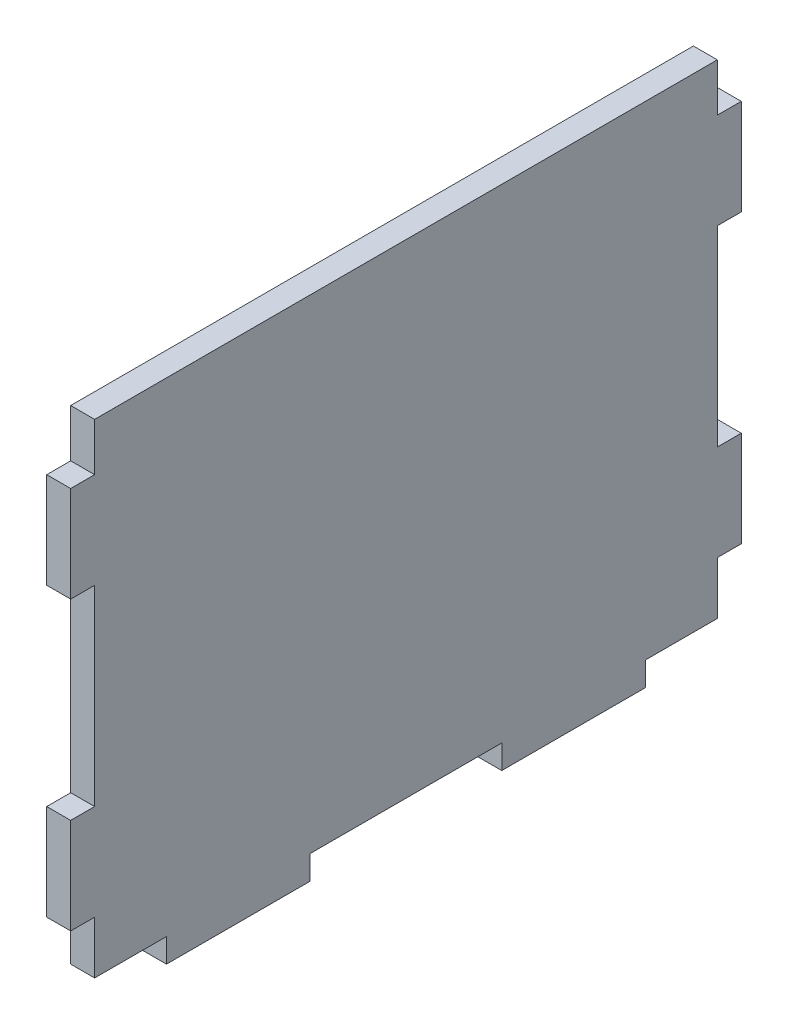
ISO-10303-21;
HEADER;
FILE_DESCRIPTION(('STEP AP214'),'2;1');
FILE_NAME('part.step','',(''),(''),'','','');
FILE_SCHEMA(('AUTOMOTIVE_DESIGN { 1 0 10303 214 1 1 1 1 }'));
ENDSEC;
DATA;
#1=APPLICATION_CONTEXT('core data for automotive mechanical design processes');
#2=APPLICATION_PROTOCOL_DEFINITION('international standard','automotive_design',2000,#1);
#3=PRODUCT_CONTEXT('',#1,'mechanical');
#4=PRODUCT('Part','Part','',(#3));
#5=PRODUCT_RELATED_PRODUCT_CATEGORY('part','',(#4));
#6=PRODUCT_DEFINITION_FORMATION('','',#4);
#7=PRODUCT_DEFINITION_CONTEXT('part definition',#1,'design');
#8=PRODUCT_DEFINITION('design','',#6,#7);
#9=PRODUCT_DEFINITION_SHAPE('','',#8);
#10=(LENGTH_UNIT() NAMED_UNIT(*) SI_UNIT(.MILLI.,.METRE.));
#11=(NAMED_UNIT(*) PLANE_ANGLE_UNIT() SI_UNIT($,.RADIAN.));
#12=(NAMED_UNIT(*) SI_UNIT($,.STERADIAN.) SOLID_ANGLE_UNIT());
#13=UNCERTAINTY_MEASURE_WITH_UNIT(LENGTH_MEASURE(1.E-05),#10,'distance_accuracy_value','');
#14=(GEOMETRIC_REPRESENTATION_CONTEXT(3) GLOBAL_UNCERTAINTY_ASSIGNED_CONTEXT((#13)) GLOBAL_UNIT_ASSIGNED_CONTEXT((#10,
#11,#12)) REPRESENTATION_CONTEXT('',''));
#15=CARTESIAN_POINT('',(0.,0.,0.));
#16=DIRECTION('',(0.,0.,1.));
#17=DIRECTION('',(1.,0.,0.));
#18=AXIS2_PLACEMENT_3D('',#15,#16,#17);
#19=CARTESIAN_POINT('',(2.5,0.,-32.4999999999995));
#20=DIRECTION('',(0.,0.,-1.));
#21=DIRECTION('',(-1.,0.,0.));
#22=AXIS2_PLACEMENT_3D('',#19,#20,#21);
#23=PLANE('',#22);
#24=DIRECTION('',(0.,-1.,0.));
#25=VECTOR('',#24,1.);
#26=CARTESIAN_POINT('',(0.,0.,-32.4999999999995));
#27=LINE('',#26,#25);
#28=CARTESIAN_POINT('',(0.,24.9999999999998,-32.4999999999995));
#29=VERTEX_POINT('',#28);
#30=CARTESIAN_POINT('',(0.,19.9999999999999,-32.4999999999995));
#31=VERTEX_POINT('',#30);
#32=EDGE_CURVE('E259',#29,#31,#27,.T.);
#33=ORIENTED_EDGE('',*,*,#32,.F.);
#34=DIRECTION('',(-1.,0.,0.));
#35=VECTOR('',#34,1.);
#36=CARTESIAN_POINT('',(2.5,24.9999999999998,-32.4999999999995));
#37=LINE('',#36,#35);
#38=CARTESIAN_POINT('',(2.5,24.9999999999998,-32.4999999999995));
#39=VERTEX_POINT('',#38);
#40=EDGE_CURVE('E11',#39,#29,#37,.T.);
#41=ORIENTED_EDGE('',*,*,#40,.F.);
#42=DIRECTION('',(0.,-1.,0.));
#43=VECTOR('',#42,1.);
#44=CARTESIAN_POINT('',(2.5,0.,-32.4999999999995));
#45=LINE('',#44,#43);
#46=CARTESIAN_POINT('',(2.5,19.9999999999999,-32.4999999999995));
#47=VERTEX_POINT('',#46);
#48=EDGE_CURVE('E353',#39,#47,#45,.T.);
#49=ORIENTED_EDGE('',*,*,#48,.T.);
#50=DIRECTION('',(-1.,0.,0.));
#51=VECTOR('',#50,1.);
#52=CARTESIAN_POINT('',(2.5,19.9999999999999,-32.4999999999995));
#53=LINE('',#52,#51);
#54=EDGE_CURVE('E153',#47,#31,#53,.T.);
#55=ORIENTED_EDGE('',*,*,#54,.T.);
#56=EDGE_LOOP('',(#33,#41,#49,#55));
#57=FACE_BOUND('',#56,.T.);
#58=ADVANCED_FACE('F41',(#57),#23,.T.);
#59=CARTESIAN_POINT('',(2.5,24.9999999999998,0.));
#60=DIRECTION('',(0.,1.,0.));
#61=DIRECTION('',(0.,0.,1.));
#62=AXIS2_PLACEMENT_3D('',#59,#60,#61);
#63=PLANE('',#62);
#64=DIRECTION('',(0.,0.,-1.));
#65=VECTOR('',#64,1.);
#66=CARTESIAN_POINT('',(0.,24.9999999999998,0.));
#67=LINE('',#66,#65);
#68=CARTESIAN_POINT('',(0.,24.9999999999998,32.4999999999995));
#69=VERTEX_POINT('',#68);
#70=EDGE_CURVE('E263',#69,#29,#67,.T.);
#71=ORIENTED_EDGE('',*,*,#70,.F.);
#72=DIRECTION('',(-1.,0.,0.));
#73=VECTOR('',#72,1.);
#74=CARTESIAN_POINT('',(2.5,24.9999999999998,32.4999999999995));
#75=LINE('',#74,#73);
#76=CARTESIAN_POINT('',(2.5,24.9999999999998,32.4999999999995));
#77=VERTEX_POINT('',#76);
#78=EDGE_CURVE('E50',#77,#69,#75,.T.);
#79=ORIENTED_EDGE('',*,*,#78,.F.);
#80=DIRECTION('',(0.,0.,-1.));
#81=VECTOR('',#80,1.);
#82=CARTESIAN_POINT('',(2.5,24.9999999999998,0.));
#83=LINE('',#82,#81);
#84=EDGE_CURVE('E447',#77,#39,#83,.T.);
#85=ORIENTED_EDGE('',*,*,#84,.T.);
#86=ORIENTED_EDGE('',*,*,#40,.T.);
#87=EDGE_LOOP('',(#71,#79,#85,#86));
#88=FACE_BOUND('',#87,.T.);
#89=ADVANCED_FACE('F446',(#88),#63,.T.);
#90=CARTESIAN_POINT('',(2.5,0.,32.4999999999995));
#91=DIRECTION('',(0.,0.,-1.));
#92=DIRECTION('',(-1.,0.,0.));
#93=AXIS2_PLACEMENT_3D('',#90,#91,#92);
#94=PLANE('',#93);
#95=DIRECTION('',(0.,-1.,0.));
#96=VECTOR('',#95,1.);
#97=CARTESIAN_POINT('',(0.,0.,32.4999999999995));
#98=LINE('',#97,#96);
#99=CARTESIAN_POINT('',(0.,19.9999999999999,32.4999999999995));
#100=VERTEX_POINT('',#99);
#101=EDGE_CURVE('E267',#69,#100,#98,.T.);
#102=ORIENTED_EDGE('',*,*,#101,.T.);
#103=DIRECTION('',(-1.,0.,0.));
#104=VECTOR('',#103,1.);
#105=CARTESIAN_POINT('',(2.5,19.9999999999999,32.4999999999995));
#106=LINE('',#105,#104);
#107=CARTESIAN_POINT('',(2.5,19.9999999999999,32.4999999999995));
#108=VERTEX_POINT('',#107);
#109=EDGE_CURVE('E430',#108,#100,#106,.T.);
#110=ORIENTED_EDGE('',*,*,#109,.F.);
#111=DIRECTION('',(0.,-1.,0.));
#112=VECTOR('',#111,1.);
#113=CARTESIAN_POINT('',(2.5,0.,32.4999999999995));
#114=LINE('',#113,#112);
#115=EDGE_CURVE('E438',#77,#108,#114,.T.);
#116=ORIENTED_EDGE('',*,*,#115,.F.);
#117=ORIENTED_EDGE('',*,*,#78,.T.);
#118=EDGE_LOOP('',(#102,#110,#116,#117));
#119=FACE_BOUND('',#118,.T.);
#120=ADVANCED_FACE('F436',(#119),#94,.F.);
#121=CARTESIAN_POINT('',(2.5,19.9999999999999,0.));
#122=DIRECTION('',(0.,1.,0.));
#123=DIRECTION('',(0.,0.,1.));
#124=AXIS2_PLACEMENT_3D('',#121,#122,#123);
#125=PLANE('',#124);
#126=DIRECTION('',(0.,0.,-1.));
#127=VECTOR('',#126,1.);
#128=CARTESIAN_POINT('',(0.,19.9999999999999,0.));
#129=LINE('',#128,#127);
#130=CARTESIAN_POINT('',(0.,19.9999999999999,34.9999999999995));
#131=VERTEX_POINT('',#130);
#132=EDGE_CURVE('E271',#131,#100,#129,.T.);
#133=ORIENTED_EDGE('',*,*,#132,.F.);
#134=DIRECTION('',(-1.,0.,0.));
#135=VECTOR('',#134,1.);
#136=CARTESIAN_POINT('',(2.5,19.9999999999999,34.9999999999995));
#137=LINE('',#136,#135);
#138=CARTESIAN_POINT('',(2.5,19.9999999999999,34.9999999999995));
#139=VERTEX_POINT('',#138);
#140=EDGE_CURVE('E427',#139,#131,#137,.T.);
#141=ORIENTED_EDGE('',*,*,#140,.F.);
#142=DIRECTION('',(0.,0.,-1.));
#143=VECTOR('',#142,1.);
#144=CARTESIAN_POINT('',(2.5,19.9999999999999,0.));
#145=LINE('',#144,#143);
#146=EDGE_CURVE('E458',#139,#108,#145,.T.);
#147=ORIENTED_EDGE('',*,*,#146,.T.);
#148=ORIENTED_EDGE('',*,*,#109,.T.);
#149=EDGE_LOOP('',(#133,#141,#147,#148));
#150=FACE_BOUND('',#149,.T.);
#151=ADVANCED_FACE('F591',(#150),#125,.T.);
#152=CARTESIAN_POINT('',(2.5,0.,34.9999999999995));
#153=DIRECTION('',(0.,0.,1.));
#154=DIRECTION('',(0.,-1.,0.));
#155=AXIS2_PLACEMENT_3D('',#152,#153,#154);
#156=PLANE('',#155);
#157=DIRECTION('',(0.,1.,0.));
#158=VECTOR('',#157,1.);
#159=CARTESIAN_POINT('',(0.,0.,34.9999999999995));
#160=LINE('',#159,#158);
#161=CARTESIAN_POINT('',(0.,9.99999999999986,34.9999999999995));
#162=VERTEX_POINT('',#161);
#163=EDGE_CURVE('E275',#162,#131,#160,.T.);
#164=ORIENTED_EDGE('',*,*,#163,.F.);
#165=DIRECTION('',(-1.,0.,0.));
#166=VECTOR('',#165,1.);
#167=CARTESIAN_POINT('',(2.5,9.99999999999986,34.9999999999995));
#168=LINE('',#167,#166);
#169=CARTESIAN_POINT('',(2.5,9.99999999999986,34.9999999999995));
#170=VERTEX_POINT('',#169);
#171=EDGE_CURVE('E424',#170,#162,#168,.T.);
#172=ORIENTED_EDGE('',*,*,#171,.F.);
#173=DIRECTION('',(0.,1.,0.));
#174=VECTOR('',#173,1.);
#175=CARTESIAN_POINT('',(2.5,0.,34.9999999999995));
#176=LINE('',#175,#174);
#177=EDGE_CURVE('E462',#170,#139,#176,.T.);
#178=ORIENTED_EDGE('',*,*,#177,.T.);
#179=ORIENTED_EDGE('',*,*,#140,.T.);
#180=EDGE_LOOP('',(#164,#172,#178,#179));
#181=FACE_BOUND('',#180,.T.);
#182=ADVANCED_FACE('F596',(#181),#156,.T.);
#183=CARTESIAN_POINT('',(2.5,9.99999999999989,0.));
#184=DIRECTION('',(0.,-1.,0.));
#185=DIRECTION('',(0.,0.,-1.));
#186=AXIS2_PLACEMENT_3D('',#183,#184,#185);
#187=PLANE('',#186);
#188=DIRECTION('',(0.,0.,1.));
#189=VECTOR('',#188,1.);
#190=CARTESIAN_POINT('',(0.,9.99999999999989,0.));
#191=LINE('',#190,#189);
#192=CARTESIAN_POINT('',(0.,9.99999999999987,32.4999999999995));
#193=VERTEX_POINT('',#192);
#194=EDGE_CURVE('E279',#193,#162,#191,.T.);
#195=ORIENTED_EDGE('',*,*,#194,.F.);
#196=DIRECTION('',(-1.,0.,0.));
#197=VECTOR('',#196,1.);
#198=CARTESIAN_POINT('',(2.5,9.99999999999987,32.4999999999995));
#199=LINE('',#198,#197);
#200=CARTESIAN_POINT('',(2.5,9.99999999999987,32.4999999999995));
#201=VERTEX_POINT('',#200);
#202=EDGE_CURVE('E421',#201,#193,#199,.T.);
#203=ORIENTED_EDGE('',*,*,#202,.F.);
#204=DIRECTION('',(0.,0.,1.));
#205=VECTOR('',#204,1.);
#206=CARTESIAN_POINT('',(2.5,9.99999999999989,0.));
#207=LINE('',#206,#205);
#208=EDGE_CURVE('E466',#201,#170,#207,.T.);
#209=ORIENTED_EDGE('',*,*,#208,.T.);
#210=ORIENTED_EDGE('',*,*,#171,.T.);
#211=EDGE_LOOP('',(#195,#203,#209,#210));
#212=FACE_BOUND('',#211,.T.);
#213=ADVANCED_FACE('F600',(#212),#187,.T.);
#214=CARTESIAN_POINT('',(2.5,0.,32.4999999999995));
#215=DIRECTION('',(0.,0.,1.));
#216=DIRECTION('',(1.,0.,0.));
#217=AXIS2_PLACEMENT_3D('',#214,#215,#216);
#218=PLANE('',#217);
#219=DIRECTION('',(0.,1.,0.));
#220=VECTOR('',#219,1.);
#221=CARTESIAN_POINT('',(0.,0.,32.4999999999995));
#222=LINE('',#221,#220);
#223=CARTESIAN_POINT('',(0.,-9.99999999999987,32.4999999999995));
#224=VERTEX_POINT('',#223);
#225=EDGE_CURVE('E283',#224,#193,#222,.T.);
#226=ORIENTED_EDGE('',*,*,#225,.F.);
#227=DIRECTION('',(-1.,0.,0.));
#228=VECTOR('',#227,1.);
#229=CARTESIAN_POINT('',(2.5,-9.99999999999987,32.4999999999995));
#230=LINE('',#229,#228);
#231=CARTESIAN_POINT('',(2.5,-9.99999999999987,32.4999999999995));
#232=VERTEX_POINT('',#231);
#233=EDGE_CURVE('E418',#232,#224,#230,.T.);
#234=ORIENTED_EDGE('',*,*,#233,.F.);
#235=DIRECTION('',(0.,1.,0.));
#236=VECTOR('',#235,1.);
#237=CARTESIAN_POINT('',(2.5,0.,32.4999999999995));
#238=LINE('',#237,#236);
#239=EDGE_CURVE('E470',#232,#201,#238,.T.);
#240=ORIENTED_EDGE('',*,*,#239,.T.);
#241=ORIENTED_EDGE('',*,*,#202,.T.);
#242=EDGE_LOOP('',(#226,#234,#240,#241));
#243=FACE_BOUND('',#242,.T.);
#244=ADVANCED_FACE('F604',(#243),#218,.T.);
#245=CARTESIAN_POINT('',(2.5,-9.99999999999989,0.));
#246=DIRECTION('',(0.,-1.,0.));
#247=DIRECTION('',(0.,0.,-1.));
#248=AXIS2_PLACEMENT_3D('',#245,#246,#247);
#249=PLANE('',#248);
#250=DIRECTION('',(0.,0.,1.));
#251=VECTOR('',#250,1.);
#252=CARTESIAN_POINT('',(0.,-9.99999999999989,0.));
#253=LINE('',#252,#251);
#254=CARTESIAN_POINT('',(0.,-9.99999999999986,34.9999999999995));
#255=VERTEX_POINT('',#254);
#256=EDGE_CURVE('E287',#224,#255,#253,.T.);
#257=ORIENTED_EDGE('',*,*,#256,.T.);
#258=DIRECTION('',(-1.,0.,0.));
#259=VECTOR('',#258,1.);
#260=CARTESIAN_POINT('',(2.5,-9.99999999999986,34.9999999999995));
#261=LINE('',#260,#259);
#262=CARTESIAN_POINT('',(2.5,-9.99999999999986,34.9999999999995));
#263=VERTEX_POINT('',#262);
#264=EDGE_CURVE('E414',#263,#255,#261,.T.);
#265=ORIENTED_EDGE('',*,*,#264,.F.);
#266=DIRECTION('',(0.,0.,1.));
#267=VECTOR('',#266,1.);
#268=CARTESIAN_POINT('',(2.5,-9.99999999999989,0.));
#269=LINE('',#268,#267);
#270=EDGE_CURVE('E474',#232,#263,#269,.T.);
#271=ORIENTED_EDGE('',*,*,#270,.F.);
#272=ORIENTED_EDGE('',*,*,#233,.T.);
#273=EDGE_LOOP('',(#257,#265,#271,#272));
#274=FACE_BOUND('',#273,.T.);
#275=ADVANCED_FACE('F608',(#274),#249,.F.);
#276=CARTESIAN_POINT('',(2.5,0.,34.9999999999995));
#277=DIRECTION('',(0.,0.,-1.));
#278=DIRECTION('',(0.,1.,0.));
#279=AXIS2_PLACEMENT_3D('',#276,#277,#278);
#280=PLANE('',#279);
#281=DIRECTION('',(0.,-1.,0.));
#282=VECTOR('',#281,1.);
#283=CARTESIAN_POINT('',(0.,0.,34.9999999999995));
#284=LINE('',#283,#282);
#285=CARTESIAN_POINT('',(0.,-19.9999999999999,34.9999999999995));
#286=VERTEX_POINT('',#285);
#287=EDGE_CURVE('E290',#255,#286,#284,.T.);
#288=ORIENTED_EDGE('',*,*,#287,.T.);
#289=DIRECTION('',(-1.,0.,0.));
#290=VECTOR('',#289,1.);
#291=CARTESIAN_POINT('',(2.5,-19.9999999999999,34.9999999999995));
#292=LINE('',#291,#290);
#293=CARTESIAN_POINT('',(2.5,-19.9999999999999,34.9999999999995));
#294=VERTEX_POINT('',#293);
#295=EDGE_CURVE('E410',#294,#286,#292,.T.);
#296=ORIENTED_EDGE('',*,*,#295,.F.);
#297=DIRECTION('',(0.,-1.,0.));
#298=VECTOR('',#297,1.);
#299=CARTESIAN_POINT('',(2.5,0.,34.9999999999995));
#300=LINE('',#299,#298);
#301=EDGE_CURVE('E477',#263,#294,#300,.T.);
#302=ORIENTED_EDGE('',*,*,#301,.F.);
#303=ORIENTED_EDGE('',*,*,#264,.T.);
#304=EDGE_LOOP('',(#288,#296,#302,#303));
#305=FACE_BOUND('',#304,.T.);
#306=ADVANCED_FACE('F612',(#305),#280,.F.);
#307=CARTESIAN_POINT('',(2.5,-19.9999999999999,0.));
#308=DIRECTION('',(0.,1.,0.));
#309=DIRECTION('',(0.,0.,1.));
#310=AXIS2_PLACEMENT_3D('',#307,#308,#309);
#311=PLANE('',#310);
#312=DIRECTION('',(0.,0.,-1.));
#313=VECTOR('',#312,1.);
#314=CARTESIAN_POINT('',(0.,-19.9999999999999,0.));
#315=LINE('',#314,#313);
#316=CARTESIAN_POINT('',(0.,-19.9999999999999,32.4999999999995));
#317=VERTEX_POINT('',#316);
#318=EDGE_CURVE('E293',#286,#317,#315,.T.);
#319=ORIENTED_EDGE('',*,*,#318,.T.);
#320=DIRECTION('',(-1.,0.,0.));
#321=VECTOR('',#320,1.);
#322=CARTESIAN_POINT('',(2.5,-19.9999999999999,32.4999999999995));
#323=LINE('',#322,#321);
#324=CARTESIAN_POINT('',(2.5,-19.9999999999999,32.4999999999995));
#325=VERTEX_POINT('',#324);
#326=EDGE_CURVE('E406',#325,#317,#323,.T.);
#327=ORIENTED_EDGE('',*,*,#326,.F.);
#328=DIRECTION('',(0.,0.,-1.));
#329=VECTOR('',#328,1.);
#330=CARTESIAN_POINT('',(2.5,-19.9999999999999,0.));
#331=LINE('',#330,#329);
#332=EDGE_CURVE('E480',#294,#325,#331,.T.);
#333=ORIENTED_EDGE('',*,*,#332,.F.);
#334=ORIENTED_EDGE('',*,*,#295,.T.);
#335=EDGE_LOOP('',(#319,#327,#333,#334));
#336=FACE_BOUND('',#335,.T.);
#337=ADVANCED_FACE('F616',(#336),#311,.F.);
#338=CARTESIAN_POINT('',(2.5,0.,32.4999999999996));
#339=DIRECTION('',(0.,0.,-1.));
#340=DIRECTION('',(0.,1.,0.));
#341=AXIS2_PLACEMENT_3D('',#338,#339,#340);
#342=PLANE('',#341);
#343=DIRECTION('',(0.,-1.,0.));
#344=VECTOR('',#343,1.);
#345=CARTESIAN_POINT('',(0.,0.,32.4999999999996));
#346=LINE('',#345,#344);
#347=CARTESIAN_POINT('',(0.,-25.5000000000002,32.4999999999995));
#348=VERTEX_POINT('',#347);
#349=EDGE_CURVE('E296',#317,#348,#346,.T.);
#350=ORIENTED_EDGE('',*,*,#349,.T.);
#351=DIRECTION('',(-1.,0.,0.));
#352=VECTOR('',#351,1.);
#353=CARTESIAN_POINT('',(2.5,-25.5000000000002,32.4999999999995));
#354=LINE('',#353,#352);
#355=CARTESIAN_POINT('',(2.5,-25.5000000000002,32.4999999999995));
#356=VERTEX_POINT('',#355);
#357=EDGE_CURVE('E402',#356,#348,#354,.T.);
#358=ORIENTED_EDGE('',*,*,#357,.F.);
#359=DIRECTION('',(0.,-1.,0.));
#360=VECTOR('',#359,1.);
#361=CARTESIAN_POINT('',(2.5,0.,32.4999999999996));
#362=LINE('',#361,#360);
#363=EDGE_CURVE('E483',#325,#356,#362,.T.);
#364=ORIENTED_EDGE('',*,*,#363,.F.);
#365=ORIENTED_EDGE('',*,*,#326,.T.);
#366=EDGE_LOOP('',(#350,#358,#364,#365));
#367=FACE_BOUND('',#366,.T.);
#368=ADVANCED_FACE('F620',(#367),#342,.F.);
#369=CARTESIAN_POINT('',(2.5,-25.5000000000002,0.));
#370=DIRECTION('',(0.,1.,0.));
#371=DIRECTION('',(0.,0.,1.));
#372=AXIS2_PLACEMENT_3D('',#369,#370,#371);
#373=PLANE('',#372);
#374=DIRECTION('',(0.,0.,-1.));
#375=VECTOR('',#374,1.);
#376=CARTESIAN_POINT('',(0.,-25.5000000000002,0.));
#377=LINE('',#376,#375);
#378=CARTESIAN_POINT('',(0.,-25.5000000000002,24.9999999999992));
#379=VERTEX_POINT('',#378);
#380=EDGE_CURVE('E299',#348,#379,#377,.T.);
#381=ORIENTED_EDGE('',*,*,#380,.T.);
#382=DIRECTION('',(-1.,0.,0.));
#383=VECTOR('',#382,1.);
#384=CARTESIAN_POINT('',(2.5,-25.5000000000002,24.9999999999992));
#385=LINE('',#384,#383);
#386=CARTESIAN_POINT('',(2.5,-25.5000000000002,24.9999999999992));
#387=VERTEX_POINT('',#386);
#388=EDGE_CURVE('E398',#387,#379,#385,.T.);
#389=ORIENTED_EDGE('',*,*,#388,.F.);
#390=DIRECTION('',(0.,0.,-1.));
#391=VECTOR('',#390,1.);
#392=CARTESIAN_POINT('',(2.5,-25.5000000000002,0.));
#393=LINE('',#392,#391);
#394=EDGE_CURVE('E486',#356,#387,#393,.T.);
#395=ORIENTED_EDGE('',*,*,#394,.F.);
#396=ORIENTED_EDGE('',*,*,#357,.T.);
#397=EDGE_LOOP('',(#381,#389,#395,#396));
#398=FACE_BOUND('',#397,.T.);
#399=ADVANCED_FACE('F583',(#398),#373,.F.);
#400=CARTESIAN_POINT('',(2.5,3.36536354339456E-12,24.9999999999958));
#401=DIRECTION('',(0.,-1.34614541735805E-13,-1.));
#402=DIRECTION('',(0.,1.,-1.34614541735805E-13));
#403=AXIS2_PLACEMENT_3D('',#400,#401,#402);
#404=PLANE('',#403);
#405=DIRECTION('',(0.,-1.,1.34614541735805E-13));
#406=VECTOR('',#405,1.);
#407=CARTESIAN_POINT('',(0.,3.36536354339456E-12,24.9999999999958));
#408=LINE('',#407,#406);
#409=CARTESIAN_POINT('',(0.,-28.,24.9999999999995));
#410=VERTEX_POINT('',#409);
#411=EDGE_CURVE('E302',#379,#410,#408,.T.);
#412=ORIENTED_EDGE('',*,*,#411,.T.);
#413=DIRECTION('',(-1.,0.,0.));
#414=VECTOR('',#413,1.);
#415=CARTESIAN_POINT('',(2.5,-28.,24.9999999999995));
#416=LINE('',#415,#414);
#417=CARTESIAN_POINT('',(2.5,-28.,24.9999999999995));
#418=VERTEX_POINT('',#417);
#419=EDGE_CURVE('E394',#418,#410,#416,.T.);
#420=ORIENTED_EDGE('',*,*,#419,.F.);
#421=DIRECTION('',(0.,-1.,1.34614541735805E-13));
#422=VECTOR('',#421,1.);
#423=CARTESIAN_POINT('',(2.5,3.36536354339456E-12,24.9999999999958));
#424=LINE('',#423,#422);
#425=EDGE_CURVE('E489',#387,#418,#424,.T.);
#426=ORIENTED_EDGE('',*,*,#425,.F.);
#427=ORIENTED_EDGE('',*,*,#388,.T.);
#428=EDGE_LOOP('',(#412,#420,#426,#427));
#429=FACE_BOUND('',#428,.T.);
#430=ADVANCED_FACE('F625',(#429),#404,.F.);
#431=CARTESIAN_POINT('',(2.5,-28.,0.));
#432=DIRECTION('',(0.,1.,0.));
#433=DIRECTION('',(0.,0.,1.));
#434=AXIS2_PLACEMENT_3D('',#431,#432,#433);
#435=PLANE('',#434);
#436=DIRECTION('',(0.,0.,-1.));
#437=VECTOR('',#436,1.);
#438=CARTESIAN_POINT('',(0.,-28.,0.));
#439=LINE('',#438,#437);
#440=CARTESIAN_POINT('',(0.,-28.,9.99999999999954));
#441=VERTEX_POINT('',#440);
#442=EDGE_CURVE('E307',#410,#441,#439,.T.);
#443=ORIENTED_EDGE('',*,*,#442,.T.);
#444=DIRECTION('',(-1.,0.,0.));
#445=VECTOR('',#444,1.);
#446=CARTESIAN_POINT('',(2.5,-28.,9.99999999999954));
#447=LINE('',#446,#445);
#448=CARTESIAN_POINT('',(2.5,-28.,9.99999999999954));
#449=VERTEX_POINT('',#448);
#450=EDGE_CURVE('E391',#449,#441,#447,.T.);
#451=ORIENTED_EDGE('',*,*,#450,.F.);
#452=DIRECTION('',(0.,0.,-1.));
#453=VECTOR('',#452,1.);
#454=CARTESIAN_POINT('',(2.5,-28.,0.));
#455=LINE('',#454,#453);
#456=EDGE_CURVE('E494',#418,#449,#455,.T.);
#457=ORIENTED_EDGE('',*,*,#456,.F.);
#458=ORIENTED_EDGE('',*,*,#419,.T.);
#459=EDGE_LOOP('',(#443,#451,#457,#458));
#460=FACE_BOUND('',#459,.T.);
#461=ADVANCED_FACE('F628',(#460),#435,.F.);
#462=CARTESIAN_POINT('',(2.5,1.46410661372391E-12,9.99999999999545));
#463=DIRECTION('',(0.,-1.46410661372457E-13,-1.));
#464=DIRECTION('',(0.,1.,-1.46410661372457E-13));
#465=AXIS2_PLACEMENT_3D('',#462,#463,#464);
#466=PLANE('',#465);
#467=DIRECTION('',(0.,-1.,1.46410661372457E-13));
#468=VECTOR('',#467,1.);
#469=CARTESIAN_POINT('',(0.,1.46410661372391E-12,9.99999999999545));
#470=LINE('',#469,#468);
#471=CARTESIAN_POINT('',(0.,-25.5000000000002,9.99999999999918));
#472=VERTEX_POINT('',#471);
#473=EDGE_CURVE('E311',#472,#441,#470,.T.);
#474=ORIENTED_EDGE('',*,*,#473,.F.);
#475=DIRECTION('',(-1.,0.,0.));
#476=VECTOR('',#475,1.);
#477=CARTESIAN_POINT('',(2.5,-25.5000000000002,9.99999999999918));
#478=LINE('',#477,#476);
#479=CARTESIAN_POINT('',(2.5,-25.5000000000002,9.99999999999918));
#480=VERTEX_POINT('',#479);
#481=EDGE_CURVE('E388',#480,#472,#478,.T.);
#482=ORIENTED_EDGE('',*,*,#481,.F.);
#483=DIRECTION('',(0.,-1.,1.46410661372457E-13));
#484=VECTOR('',#483,1.);
#485=CARTESIAN_POINT('',(2.5,1.46410661372391E-12,9.99999999999545));
#486=LINE('',#485,#484);
#487=EDGE_CURVE('E497',#480,#449,#486,.T.);
#488=ORIENTED_EDGE('',*,*,#487,.T.);
#489=ORIENTED_EDGE('',*,*,#450,.T.);
#490=EDGE_LOOP('',(#474,#482,#488,#489));
#491=FACE_BOUND('',#490,.T.);
#492=ADVANCED_FACE('F632',(#491),#466,.T.);
#493=CARTESIAN_POINT('',(0.,-25.5000000000002,-9.9999999999992));
#494=VERTEX_POINT('',#493);
#495=EDGE_CURVE('E304',#472,#494,#377,.T.);
#496=ORIENTED_EDGE('',*,*,#495,.T.);
#497=DIRECTION('',(-1.,0.,0.));
#498=VECTOR('',#497,1.);
#499=CARTESIAN_POINT('',(2.5,-25.5000000000002,-9.9999999999992));
#500=LINE('',#499,#498);
#501=CARTESIAN_POINT('',(2.5,-25.5000000000002,-9.9999999999992));
#502=VERTEX_POINT('',#501);
#503=EDGE_CURVE('E384',#502,#494,#500,.T.);
#504=ORIENTED_EDGE('',*,*,#503,.F.);
#505=EDGE_CURVE('E491',#480,#502,#393,.T.);
#506=ORIENTED_EDGE('',*,*,#505,.F.);
#507=ORIENTED_EDGE('',*,*,#481,.T.);
#508=EDGE_LOOP('',(#496,#504,#506,#507));
#509=FACE_BOUND('',#508,.T.);
#510=ADVANCED_FACE('F537',(#509),#373,.F.);
#511=CARTESIAN_POINT('',(2.5,1.04083408558614E-13,-9.99999999999892));
#512=DIRECTION('',(0.,0.,-1.));
#513=DIRECTION('',(0.,1.,0.));
#514=AXIS2_PLACEMENT_3D('',#511,#512,#513);
#515=PLANE('',#514);
#516=DIRECTION('',(0.,-1.,0.));
#517=VECTOR('',#516,1.);
#518=CARTESIAN_POINT('',(0.,1.04083408558614E-13,-9.99999999999892));
#519=LINE('',#518,#517);
#520=CARTESIAN_POINT('',(0.,-27.9999999999999,-9.99999999999921));
#521=VERTEX_POINT('',#520);
#522=EDGE_CURVE('E315',#494,#521,#519,.T.);
#523=ORIENTED_EDGE('',*,*,#522,.T.);
#524=DIRECTION('',(-1.,0.,0.));
#525=VECTOR('',#524,1.);
#526=CARTESIAN_POINT('',(2.5,-27.9999999999999,-9.99999999999921));
#527=LINE('',#526,#525);
#528=CARTESIAN_POINT('',(2.5,-27.9999999999999,-9.99999999999921));
#529=VERTEX_POINT('',#528);
#530=EDGE_CURVE('E381',#529,#521,#527,.T.);
#531=ORIENTED_EDGE('',*,*,#530,.F.);
#532=DIRECTION('',(0.,-1.,0.));
#533=VECTOR('',#532,1.);
#534=CARTESIAN_POINT('',(2.5,1.04083408558614E-13,-9.99999999999892));
#535=LINE('',#534,#533);
#536=EDGE_CURVE('E501',#502,#529,#535,.T.);
#537=ORIENTED_EDGE('',*,*,#536,.F.);
#538=ORIENTED_EDGE('',*,*,#503,.T.);
#539=EDGE_LOOP('',(#523,#531,#537,#538));
#540=FACE_BOUND('',#539,.T.);
#541=ADVANCED_FACE('F541',(#540),#515,.F.);
#542=CARTESIAN_POINT('',(2.5,-27.9999999999998,2.59052039079195E-13));
#543=DIRECTION('',(0.,-1.,0.));
#544=DIRECTION('',(0.,0.,-1.));
#545=AXIS2_PLACEMENT_3D('',#542,#543,#544);
#546=PLANE('',#545);
#547=DIRECTION('',(0.,0.,1.));
#548=VECTOR('',#547,1.);
#549=CARTESIAN_POINT('',(0.,-27.9999999999998,2.59052039079195E-13));
#550=LINE('',#549,#548);
#551=CARTESIAN_POINT('',(0.,-28.,-24.9999999999995));
#552=VERTEX_POINT('',#551);
#553=EDGE_CURVE('E319',#552,#521,#550,.T.);
#554=ORIENTED_EDGE('',*,*,#553,.F.);
#555=DIRECTION('',(-1.,0.,0.));
#556=VECTOR('',#555,1.);
#557=CARTESIAN_POINT('',(2.5,-28.,-24.9999999999995));
#558=LINE('',#557,#556);
#559=CARTESIAN_POINT('',(2.5,-28.,-24.9999999999995));
#560=VERTEX_POINT('',#559);
#561=EDGE_CURVE('E378',#560,#552,#558,.T.);
#562=ORIENTED_EDGE('',*,*,#561,.F.);
#563=DIRECTION('',(0.,0.,1.));
#564=VECTOR('',#563,1.);
#565=CARTESIAN_POINT('',(2.5,-27.9999999999998,2.59052039079195E-13));
#566=LINE('',#565,#564);
#567=EDGE_CURVE('E504',#560,#529,#566,.T.);
#568=ORIENTED_EDGE('',*,*,#567,.T.);
#569=ORIENTED_EDGE('',*,*,#530,.T.);
#570=EDGE_LOOP('',(#554,#562,#568,#569));
#571=FACE_BOUND('',#570,.T.);
#572=ADVANCED_FACE('F544',(#571),#546,.T.);
#573=CARTESIAN_POINT('',(2.5,3.40005801291412E-12,-24.9999999999957));
#574=DIRECTION('',(0.,1.36002320516588E-13,-1.));
#575=DIRECTION('',(0.,1.,1.36002320516588E-13));
#576=AXIS2_PLACEMENT_3D('',#573,#574,#575);
#577=PLANE('',#576);
#578=DIRECTION('',(0.,-1.,-1.36002320516588E-13));
#579=VECTOR('',#578,1.);
#580=CARTESIAN_POINT('',(0.,3.40005801291412E-12,-24.9999999999957));
#581=LINE('',#580,#579);
#582=CARTESIAN_POINT('',(0.,-25.5000000000001,-24.9999999999992));
#583=VERTEX_POINT('',#582);
#584=EDGE_CURVE('E323',#583,#552,#581,.T.);
#585=ORIENTED_EDGE('',*,*,#584,.F.);
#586=DIRECTION('',(-1.,0.,0.));
#587=VECTOR('',#586,1.);
#588=CARTESIAN_POINT('',(2.5,-25.5000000000001,-24.9999999999992));
#589=LINE('',#588,#587);
#590=CARTESIAN_POINT('',(2.5,-25.5000000000001,-24.9999999999992));
#591=VERTEX_POINT('',#590);
#592=EDGE_CURVE('E375',#591,#583,#589,.T.);
#593=ORIENTED_EDGE('',*,*,#592,.F.);
#594=DIRECTION('',(0.,-1.,-1.36002320516588E-13));
#595=VECTOR('',#594,1.);
#596=CARTESIAN_POINT('',(2.5,3.40005801291412E-12,-24.9999999999957));
#597=LINE('',#596,#595);
#598=EDGE_CURVE('E508',#591,#560,#597,.T.);
#599=ORIENTED_EDGE('',*,*,#598,.T.);
#600=ORIENTED_EDGE('',*,*,#561,.T.);
#601=EDGE_LOOP('',(#585,#593,#599,#600));
#602=FACE_BOUND('',#601,.T.);
#603=ADVANCED_FACE('F548',(#602),#577,.T.);
#604=CARTESIAN_POINT('',(0.,-25.5000000000001,-32.4999999999995));
#605=VERTEX_POINT('',#604);
#606=EDGE_CURVE('E303',#583,#605,#377,.T.);
#607=ORIENTED_EDGE('',*,*,#606,.T.);
#608=DIRECTION('',(-1.,0.,0.));
#609=VECTOR('',#608,1.);
#610=CARTESIAN_POINT('',(2.5,-25.5000000000001,-32.4999999999995));
#611=LINE('',#610,#609);
#612=CARTESIAN_POINT('',(2.5,-25.5000000000001,-32.4999999999995));
#613=VERTEX_POINT('',#612);
#614=EDGE_CURVE('E372',#613,#605,#611,.T.);
#615=ORIENTED_EDGE('',*,*,#614,.F.);
#616=EDGE_CURVE('E490',#591,#613,#393,.T.);
#617=ORIENTED_EDGE('',*,*,#616,.F.);
#618=ORIENTED_EDGE('',*,*,#592,.T.);
#619=EDGE_LOOP('',(#607,#615,#617,#618));
#620=FACE_BOUND('',#619,.T.);
#621=ADVANCED_FACE('F554',(#620),#373,.F.);
#622=CARTESIAN_POINT('',(2.5,0.,-32.4999999999996));
#623=DIRECTION('',(0.,0.,-1.));
#624=DIRECTION('',(0.,1.,0.));
#625=AXIS2_PLACEMENT_3D('',#622,#623,#624);
#626=PLANE('',#625);
#627=DIRECTION('',(0.,-1.,0.));
#628=VECTOR('',#627,1.);
#629=CARTESIAN_POINT('',(0.,0.,-32.4999999999996));
#630=LINE('',#629,#628);
#631=CARTESIAN_POINT('',(0.,-19.9999999999999,-32.4999999999995));
#632=VERTEX_POINT('',#631);
#633=EDGE_CURVE('E327',#632,#605,#630,.T.);
#634=ORIENTED_EDGE('',*,*,#633,.F.);
#635=DIRECTION('',(-1.,0.,0.));
#636=VECTOR('',#635,1.);
#637=CARTESIAN_POINT('',(2.5,-19.9999999999999,-32.4999999999995));
#638=LINE('',#637,#636);
#639=CARTESIAN_POINT('',(2.5,-19.9999999999999,-32.4999999999995));
#640=VERTEX_POINT('',#639);
#641=EDGE_CURVE('E369',#640,#632,#638,.T.);
#642=ORIENTED_EDGE('',*,*,#641,.F.);
#643=DIRECTION('',(0.,-1.,0.));
#644=VECTOR('',#643,1.);
#645=CARTESIAN_POINT('',(2.5,0.,-32.4999999999996));
#646=LINE('',#645,#644);
#647=EDGE_CURVE('E512',#640,#613,#646,.T.);
#648=ORIENTED_EDGE('',*,*,#647,.T.);
#649=ORIENTED_EDGE('',*,*,#614,.T.);
#650=EDGE_LOOP('',(#634,#642,#648,#649));
#651=FACE_BOUND('',#650,.T.);
#652=ADVANCED_FACE('F572',(#651),#626,.T.);
#653=CARTESIAN_POINT('',(2.5,-19.9999999999999,0.));
#654=DIRECTION('',(0.,-1.,0.));
#655=DIRECTION('',(0.,0.,-1.));
#656=AXIS2_PLACEMENT_3D('',#653,#654,#655);
#657=PLANE('',#656);
#658=DIRECTION('',(0.,0.,1.));
#659=VECTOR('',#658,1.);
#660=CARTESIAN_POINT('',(0.,-19.9999999999999,0.));
#661=LINE('',#660,#659);
#662=CARTESIAN_POINT('',(0.,-19.9999999999999,-34.9999999999995));
#663=VERTEX_POINT('',#662);
#664=EDGE_CURVE('E331',#663,#632,#661,.T.);
#665=ORIENTED_EDGE('',*,*,#664,.F.);
#666=DIRECTION('',(-1.,0.,0.));
#667=VECTOR('',#666,1.);
#668=CARTESIAN_POINT('',(2.5,-19.9999999999999,-34.9999999999995));
#669=LINE('',#668,#667);
#670=CARTESIAN_POINT('',(2.5,-19.9999999999999,-34.9999999999995));
#671=VERTEX_POINT('',#670);
#672=EDGE_CURVE('E366',#671,#663,#669,.T.);
#673=ORIENTED_EDGE('',*,*,#672,.F.);
#674=DIRECTION('',(0.,0.,1.));
#675=VECTOR('',#674,1.);
#676=CARTESIAN_POINT('',(2.5,-19.9999999999999,0.));
#677=LINE('',#676,#675);
#678=EDGE_CURVE('E516',#671,#640,#677,.T.);
#679=ORIENTED_EDGE('',*,*,#678,.T.);
#680=ORIENTED_EDGE('',*,*,#641,.T.);
#681=EDGE_LOOP('',(#665,#673,#679,#680));
#682=FACE_BOUND('',#681,.T.);
#683=ADVANCED_FACE('F561',(#682),#657,.T.);
#684=CARTESIAN_POINT('',(2.5,0.,-34.9999999999995));
#685=DIRECTION('',(0.,0.,-1.));
#686=DIRECTION('',(0.,1.,0.));
#687=AXIS2_PLACEMENT_3D('',#684,#685,#686);
#688=PLANE('',#687);
#689=DIRECTION('',(0.,-1.,0.));
#690=VECTOR('',#689,1.);
#691=CARTESIAN_POINT('',(0.,0.,-34.9999999999995));
#692=LINE('',#691,#690);
#693=CARTESIAN_POINT('',(0.,-9.99999999999986,-34.9999999999995));
#694=VERTEX_POINT('',#693);
#695=EDGE_CURVE('E335',#694,#663,#692,.T.);
#696=ORIENTED_EDGE('',*,*,#695,.F.);
#697=DIRECTION('',(-1.,0.,0.));
#698=VECTOR('',#697,1.);
#699=CARTESIAN_POINT('',(2.5,-9.99999999999986,-34.9999999999995));
#700=LINE('',#699,#698);
#701=CARTESIAN_POINT('',(2.5,-9.99999999999986,-34.9999999999995));
#702=VERTEX_POINT('',#701);
#703=EDGE_CURVE('E363',#702,#694,#700,.T.);
#704=ORIENTED_EDGE('',*,*,#703,.F.);
#705=DIRECTION('',(0.,-1.,0.));
#706=VECTOR('',#705,1.);
#707=CARTESIAN_POINT('',(2.5,0.,-34.9999999999995));
#708=LINE('',#707,#706);
#709=EDGE_CURVE('E520',#702,#671,#708,.T.);
#710=ORIENTED_EDGE('',*,*,#709,.T.);
#711=ORIENTED_EDGE('',*,*,#672,.T.);
#712=EDGE_LOOP('',(#696,#704,#710,#711));
#713=FACE_BOUND('',#712,.T.);
#714=ADVANCED_FACE('F565',(#713),#688,.T.);
#715=CARTESIAN_POINT('',(2.5,-9.99999999999989,0.));
#716=DIRECTION('',(0.,1.,0.));
#717=DIRECTION('',(0.,0.,1.));
#718=AXIS2_PLACEMENT_3D('',#715,#716,#717);
#719=PLANE('',#718);
#720=DIRECTION('',(0.,0.,-1.));
#721=VECTOR('',#720,1.);
#722=CARTESIAN_POINT('',(0.,-9.99999999999989,0.));
#723=LINE('',#722,#721);
#724=CARTESIAN_POINT('',(0.,-9.99999999999987,-32.4999999999995));
#725=VERTEX_POINT('',#724);
#726=EDGE_CURVE('E339',#725,#694,#723,.T.);
#727=ORIENTED_EDGE('',*,*,#726,.F.);
#728=DIRECTION('',(-1.,0.,0.));
#729=VECTOR('',#728,1.);
#730=CARTESIAN_POINT('',(2.5,-9.99999999999987,-32.4999999999995));
#731=LINE('',#730,#729);
#732=CARTESIAN_POINT('',(2.5,-9.99999999999987,-32.4999999999995));
#733=VERTEX_POINT('',#732);
#734=EDGE_CURVE('E360',#733,#725,#731,.T.);
#735=ORIENTED_EDGE('',*,*,#734,.F.);
#736=DIRECTION('',(0.,0.,-1.));
#737=VECTOR('',#736,1.);
#738=CARTESIAN_POINT('',(2.5,-9.99999999999989,0.));
#739=LINE('',#738,#737);
#740=EDGE_CURVE('E524',#733,#702,#739,.T.);
#741=ORIENTED_EDGE('',*,*,#740,.T.);
#742=ORIENTED_EDGE('',*,*,#703,.T.);
#743=EDGE_LOOP('',(#727,#735,#741,#742));
#744=FACE_BOUND('',#743,.T.);
#745=ADVANCED_FACE('F568',(#744),#719,.T.);
#746=CARTESIAN_POINT('',(2.5,0.,-32.4999999999995));
#747=DIRECTION('',(0.,0.,1.));
#748=DIRECTION('',(1.,0.,0.));
#749=AXIS2_PLACEMENT_3D('',#746,#747,#748);
#750=PLANE('',#749);
#751=DIRECTION('',(0.,1.,0.));
#752=VECTOR('',#751,1.);
#753=CARTESIAN_POINT('',(0.,0.,-32.4999999999995));
#754=LINE('',#753,#752);
#755=CARTESIAN_POINT('',(0.,9.99999999999987,-32.4999999999995));
#756=VERTEX_POINT('',#755);
#757=EDGE_CURVE('E343',#725,#756,#754,.T.);
#758=ORIENTED_EDGE('',*,*,#757,.T.);
#759=DIRECTION('',(-1.,0.,0.));
#760=VECTOR('',#759,1.);
#761=CARTESIAN_POINT('',(2.5,9.99999999999987,-32.4999999999995));
#762=LINE('',#761,#760);
#763=CARTESIAN_POINT('',(2.5,9.99999999999987,-32.4999999999995));
#764=VERTEX_POINT('',#763);
#765=EDGE_CURVE('E249',#764,#756,#762,.T.);
#766=ORIENTED_EDGE('',*,*,#765,.F.);
#767=DIRECTION('',(0.,1.,0.));
#768=VECTOR('',#767,1.);
#769=CARTESIAN_POINT('',(2.5,0.,-32.4999999999995));
#770=LINE('',#769,#768);
#771=EDGE_CURVE('E238',#733,#764,#770,.T.);
#772=ORIENTED_EDGE('',*,*,#771,.F.);
#773=ORIENTED_EDGE('',*,*,#734,.T.);
#774=EDGE_LOOP('',(#758,#766,#772,#773));
#775=FACE_BOUND('',#774,.T.);
#776=ADVANCED_FACE('F571',(#775),#750,.F.);
#777=CARTESIAN_POINT('',(2.5,9.99999999999989,0.));
#778=DIRECTION('',(0.,1.,0.));
#779=DIRECTION('',(0.,0.,1.));
#780=AXIS2_PLACEMENT_3D('',#777,#778,#779);
#781=PLANE('',#780);
#782=DIRECTION('',(0.,0.,-1.));
#783=VECTOR('',#782,1.);
#784=CARTESIAN_POINT('',(0.,9.99999999999989,0.));
#785=LINE('',#784,#783);
#786=CARTESIAN_POINT('',(0.,9.99999999999986,-34.9999999999995));
#787=VERTEX_POINT('',#786);
#788=EDGE_CURVE('E247',#756,#787,#785,.T.);
#789=ORIENTED_EDGE('',*,*,#788,.T.);
#790=DIRECTION('',(-1.,0.,0.));
#791=VECTOR('',#790,1.);
#792=CARTESIAN_POINT('',(2.5,9.99999999999986,-34.9999999999995));
#793=LINE('',#792,#791);
#794=CARTESIAN_POINT('',(2.5,9.99999999999986,-34.9999999999995));
#795=VERTEX_POINT('',#794);
#796=EDGE_CURVE('E244',#795,#787,#793,.T.);
#797=ORIENTED_EDGE('',*,*,#796,.F.);
#798=DIRECTION('',(0.,0.,-1.));
#799=VECTOR('',#798,1.);
#800=CARTESIAN_POINT('',(2.5,9.99999999999989,0.));
#801=LINE('',#800,#799);
#802=EDGE_CURVE('E231',#764,#795,#801,.T.);
#803=ORIENTED_EDGE('',*,*,#802,.F.);
#804=ORIENTED_EDGE('',*,*,#765,.T.);
#805=EDGE_LOOP('',(#789,#797,#803,#804));
#806=FACE_BOUND('',#805,.T.);
#807=ADVANCED_FACE('F245',(#806),#781,.F.);
#808=CARTESIAN_POINT('',(2.5,0.,-34.9999999999995));
#809=DIRECTION('',(0.,0.,1.));
#810=DIRECTION('',(0.,-1.,0.));
#811=AXIS2_PLACEMENT_3D('',#808,#809,#810);
#812=PLANE('',#811);
#813=DIRECTION('',(0.,1.,0.));
#814=VECTOR('',#813,1.);
#815=CARTESIAN_POINT('',(0.,0.,-34.9999999999995));
#816=LINE('',#815,#814);
#817=CARTESIAN_POINT('',(0.,19.9999999999999,-34.9999999999995));
#818=VERTEX_POINT('',#817);
#819=EDGE_CURVE('E146',#787,#818,#816,.T.);
#820=ORIENTED_EDGE('',*,*,#819,.T.);
#821=DIRECTION('',(-1.,0.,0.));
#822=VECTOR('',#821,1.);
#823=CARTESIAN_POINT('',(2.5,19.9999999999999,-34.9999999999995));
#824=LINE('',#823,#822);
#825=CARTESIAN_POINT('',(2.5,19.9999999999999,-34.9999999999995));
#826=VERTEX_POINT('',#825);
#827=EDGE_CURVE('E250',#826,#818,#824,.T.);
#828=ORIENTED_EDGE('',*,*,#827,.F.);
#829=DIRECTION('',(0.,1.,0.));
#830=VECTOR('',#829,1.);
#831=CARTESIAN_POINT('',(2.5,0.,-34.9999999999995));
#832=LINE('',#831,#830);
#833=EDGE_CURVE('E235',#795,#826,#832,.T.);
#834=ORIENTED_EDGE('',*,*,#833,.F.);
#835=ORIENTED_EDGE('',*,*,#796,.T.);
#836=EDGE_LOOP('',(#820,#828,#834,#835));
#837=FACE_BOUND('',#836,.T.);
#838=ADVANCED_FACE('F252',(#837),#812,.F.);
#839=CARTESIAN_POINT('',(2.5,19.9999999999999,0.));
#840=DIRECTION('',(0.,-1.,0.));
#841=DIRECTION('',(0.,0.,-1.));
#842=AXIS2_PLACEMENT_3D('',#839,#840,#841);
#843=PLANE('',#842);
#844=DIRECTION('',(0.,0.,1.));
#845=VECTOR('',#844,1.);
#846=CARTESIAN_POINT('',(0.,19.9999999999999,0.));
#847=LINE('',#846,#845);
#848=EDGE_CURVE('E350',#818,#31,#847,.T.);
#849=ORIENTED_EDGE('',*,*,#848,.T.);
#850=ORIENTED_EDGE('',*,*,#54,.F.);
#851=DIRECTION('',(0.,0.,1.));
#852=VECTOR('',#851,1.);
#853=CARTESIAN_POINT('',(2.5,19.9999999999999,0.));
#854=LINE('',#853,#852);
#855=EDGE_CURVE('E58',#826,#47,#854,.T.);
#856=ORIENTED_EDGE('',*,*,#855,.F.);
#857=ORIENTED_EDGE('',*,*,#827,.T.);
#858=EDGE_LOOP('',(#849,#850,#856,#857));
#859=FACE_BOUND('',#858,.T.);
#860=ADVANCED_FACE('F450',(#859),#843,.F.);
#861=CARTESIAN_POINT('',(2.5,0.,0.));
#862=DIRECTION('',(1.,0.,0.));
#863=DIRECTION('',(0.,0.,-1.));
#864=AXIS2_PLACEMENT_3D('',#861,#862,#863);
#865=PLANE('',#864);
#866=ORIENTED_EDGE('',*,*,#48,.F.);
#867=ORIENTED_EDGE('',*,*,#84,.F.);
#868=ORIENTED_EDGE('',*,*,#115,.T.);
#869=ORIENTED_EDGE('',*,*,#146,.F.);
#870=ORIENTED_EDGE('',*,*,#177,.F.);
#871=ORIENTED_EDGE('',*,*,#208,.F.);
#872=ORIENTED_EDGE('',*,*,#239,.F.);
#873=ORIENTED_EDGE('',*,*,#270,.T.);
#874=ORIENTED_EDGE('',*,*,#301,.T.);
#875=ORIENTED_EDGE('',*,*,#332,.T.);
#876=ORIENTED_EDGE('',*,*,#363,.T.);
#877=ORIENTED_EDGE('',*,*,#394,.T.);
#878=ORIENTED_EDGE('',*,*,#425,.T.);
#879=ORIENTED_EDGE('',*,*,#456,.T.);
#880=ORIENTED_EDGE('',*,*,#487,.F.);
#881=ORIENTED_EDGE('',*,*,#505,.T.);
#882=ORIENTED_EDGE('',*,*,#536,.T.);
#883=ORIENTED_EDGE('',*,*,#567,.F.);
#884=ORIENTED_EDGE('',*,*,#598,.F.);
#885=ORIENTED_EDGE('',*,*,#616,.T.);
#886=ORIENTED_EDGE('',*,*,#647,.F.);
#887=ORIENTED_EDGE('',*,*,#678,.F.);
#888=ORIENTED_EDGE('',*,*,#709,.F.);
#889=ORIENTED_EDGE('',*,*,#740,.F.);
#890=ORIENTED_EDGE('',*,*,#771,.T.);
#891=ORIENTED_EDGE('',*,*,#802,.T.);
#892=ORIENTED_EDGE('',*,*,#833,.T.);
#893=ORIENTED_EDGE('',*,*,#855,.T.);
#894=EDGE_LOOP('',(#866,#867,#868,#869,#870,#871,#872,#873,#874,#875,#876,#877,#878,#879,#880,
#881,#882,#883,#884,#885,#886,#887,#888,#889,#890,#891,#892,#893));
#895=FACE_BOUND('',#894,.T.);
#896=ADVANCED_FACE('F233',(#895),#865,.T.);
#897=CARTESIAN_POINT('',(0.,0.,0.));
#898=DIRECTION('',(1.,0.,0.));
#899=DIRECTION('',(0.,0.,-1.));
#900=AXIS2_PLACEMENT_3D('',#897,#898,#899);
#901=PLANE('',#900);
#902=ORIENTED_EDGE('',*,*,#32,.T.);
#903=ORIENTED_EDGE('',*,*,#848,.F.);
#904=ORIENTED_EDGE('',*,*,#819,.F.);
#905=ORIENTED_EDGE('',*,*,#788,.F.);
#906=ORIENTED_EDGE('',*,*,#757,.F.);
#907=ORIENTED_EDGE('',*,*,#726,.T.);
#908=ORIENTED_EDGE('',*,*,#695,.T.);
#909=ORIENTED_EDGE('',*,*,#664,.T.);
#910=ORIENTED_EDGE('',*,*,#633,.T.);
#911=ORIENTED_EDGE('',*,*,#606,.F.);
#912=ORIENTED_EDGE('',*,*,#584,.T.);
#913=ORIENTED_EDGE('',*,*,#553,.T.);
#914=ORIENTED_EDGE('',*,*,#522,.F.);
#915=ORIENTED_EDGE('',*,*,#495,.F.);
#916=ORIENTED_EDGE('',*,*,#473,.T.);
#917=ORIENTED_EDGE('',*,*,#442,.F.);
#918=ORIENTED_EDGE('',*,*,#411,.F.);
#919=ORIENTED_EDGE('',*,*,#380,.F.);
#920=ORIENTED_EDGE('',*,*,#349,.F.);
#921=ORIENTED_EDGE('',*,*,#318,.F.);
#922=ORIENTED_EDGE('',*,*,#287,.F.);
#923=ORIENTED_EDGE('',*,*,#256,.F.);
#924=ORIENTED_EDGE('',*,*,#225,.T.);
#925=ORIENTED_EDGE('',*,*,#194,.T.);
#926=ORIENTED_EDGE('',*,*,#163,.T.);
#927=ORIENTED_EDGE('',*,*,#132,.T.);
#928=ORIENTED_EDGE('',*,*,#101,.F.);
#929=ORIENTED_EDGE('',*,*,#70,.T.);
#930=EDGE_LOOP('',(#902,#903,#904,#905,#906,#907,#908,#909,#910,#911,#912,#913,#914,#915,#916,
#917,#918,#919,#920,#921,#922,#923,#924,#925,#926,#927,#928,#929));
#931=FACE_BOUND('',#930,.T.);
#932=ADVANCED_FACE('F444',(#931),#901,.F.);
#933=CLOSED_SHELL('',(#58,#89,#120,#151,#182,#213,#244,#275,#306,#337,#368,#399,#430,#461,#492,
#510,#541,#572,#603,#621,#652,#683,#714,#745,#776,#807,#838,#860,#896,#932));
#934=MANIFOLD_SOLID_BREP('B2',#933);
#935=ADVANCED_BREP_SHAPE_REPRESENTATION('',(#18,#934),#14);
#936=SHAPE_DEFINITION_REPRESENTATION(#9,#935);
ENDSEC;
END-ISO-10303-21;
